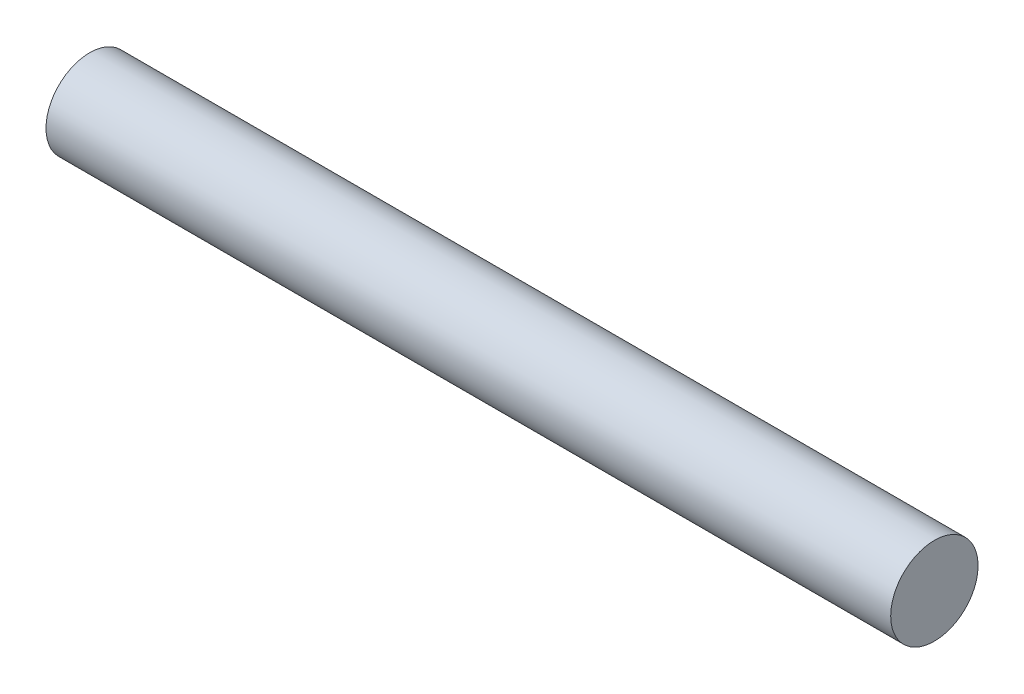
ISO-10303-21;
HEADER;
FILE_DESCRIPTION(('STEP AP214'),'2;1');
FILE_NAME('part.step','',(''),(''),'','','');
FILE_SCHEMA(('AUTOMOTIVE_DESIGN { 1 0 10303 214 1 1 1 1 }'));
ENDSEC;
DATA;
#1=APPLICATION_CONTEXT('core data for automotive mechanical design processes');
#2=APPLICATION_PROTOCOL_DEFINITION('international standard','automotive_design',2000,#1);
#3=PRODUCT_CONTEXT('',#1,'mechanical');
#4=PRODUCT('Part','Part','',(#3));
#5=PRODUCT_RELATED_PRODUCT_CATEGORY('part','',(#4));
#6=PRODUCT_DEFINITION_FORMATION('','',#4);
#7=PRODUCT_DEFINITION_CONTEXT('part definition',#1,'design');
#8=PRODUCT_DEFINITION('design','',#6,#7);
#9=PRODUCT_DEFINITION_SHAPE('','',#8);
#10=(LENGTH_UNIT() NAMED_UNIT(*) SI_UNIT(.MILLI.,.METRE.));
#11=(NAMED_UNIT(*) PLANE_ANGLE_UNIT() SI_UNIT($,.RADIAN.));
#12=(NAMED_UNIT(*) SI_UNIT($,.STERADIAN.) SOLID_ANGLE_UNIT());
#13=UNCERTAINTY_MEASURE_WITH_UNIT(LENGTH_MEASURE(1.E-05),#10,'distance_accuracy_value','');
#14=(GEOMETRIC_REPRESENTATION_CONTEXT(3) GLOBAL_UNCERTAINTY_ASSIGNED_CONTEXT((#13)) GLOBAL_UNIT_ASSIGNED_CONTEXT((#10,
#11,#12)) REPRESENTATION_CONTEXT('',''));
#15=CARTESIAN_POINT('',(0.,0.,0.));
#16=DIRECTION('',(0.,0.,1.));
#17=DIRECTION('',(1.,0.,0.));
#18=AXIS2_PLACEMENT_3D('',#15,#16,#17);
#19=CARTESIAN_POINT('',(29.,0.,0.));
#20=DIRECTION('',(-1.,0.,0.));
#21=DIRECTION('',(0.,0.,1.));
#22=AXIS2_PLACEMENT_3D('',#19,#20,#21);
#23=CYLINDRICAL_SURFACE('',#22,1.5);
#24=CARTESIAN_POINT('',(29.,0.,0.));
#25=DIRECTION('',(1.,0.,0.));
#26=DIRECTION('',(0.,0.,-1.));
#27=AXIS2_PLACEMENT_3D('',#24,#25,#26);
#28=CIRCLE('',#27,1.5);
#29=CARTESIAN_POINT('',(29.,0.,1.5));
#30=VERTEX_POINT('',#29);
#31=EDGE_CURVE('E12',#30,#30,#28,.T.);
#32=CARTESIAN_POINT('',(0.,0.,0.));
#33=DIRECTION('',(1.,0.,0.));
#34=DIRECTION('',(0.,0.,-1.));
#35=AXIS2_PLACEMENT_3D('',#32,#33,#34);
#36=CIRCLE('',#35,1.5);
#37=CARTESIAN_POINT('',(0.,0.,1.5));
#38=VERTEX_POINT('',#37);
#39=EDGE_CURVE('E49',#38,#38,#36,.T.);
#40=CARTESIAN_POINT('',(29.,0.,1.5));
#41=CARTESIAN_POINT('',(28.6979166666667,0.,1.5));
#42=CARTESIAN_POINT('',(28.3958333333333,0.,1.5));
#43=CARTESIAN_POINT('',(27.7916666666667,0.,1.5));
#44=CARTESIAN_POINT('',(27.4895833333333,0.,1.5));
#45=CARTESIAN_POINT('',(26.8854166666667,0.,1.5));
#46=CARTESIAN_POINT('',(26.5833333333333,0.,1.5));
#47=CARTESIAN_POINT('',(25.9791666666667,0.,1.5));
#48=CARTESIAN_POINT('',(25.6770833333333,0.,1.5));
#49=CARTESIAN_POINT('',(25.0729166666667,0.,1.5));
#50=CARTESIAN_POINT('',(24.7708333333333,0.,1.5));
#51=CARTESIAN_POINT('',(24.1666666666667,0.,1.5));
#52=CARTESIAN_POINT('',(23.8645833333333,0.,1.5));
#53=CARTESIAN_POINT('',(23.2604166666667,0.,1.5));
#54=CARTESIAN_POINT('',(22.9583333333333,0.,1.5));
#55=CARTESIAN_POINT('',(22.3541666666667,0.,1.5));
#56=CARTESIAN_POINT('',(22.0520833333333,0.,1.5));
#57=CARTESIAN_POINT('',(21.4479166666667,0.,1.5));
#58=CARTESIAN_POINT('',(21.1458333333333,0.,1.5));
#59=CARTESIAN_POINT('',(20.5416666666667,0.,1.5));
#60=CARTESIAN_POINT('',(20.2395833333333,0.,1.5));
#61=CARTESIAN_POINT('',(19.6354166666667,0.,1.5));
#62=CARTESIAN_POINT('',(19.3333333333333,0.,1.5));
#63=CARTESIAN_POINT('',(18.7291666666667,0.,1.5));
#64=CARTESIAN_POINT('',(18.4270833333333,0.,1.5));
#65=CARTESIAN_POINT('',(17.8229166666667,0.,1.5));
#66=CARTESIAN_POINT('',(17.5208333333333,0.,1.5));
#67=CARTESIAN_POINT('',(16.9166666666667,0.,1.5));
#68=CARTESIAN_POINT('',(16.6145833333333,0.,1.5));
#69=CARTESIAN_POINT('',(16.0104166666667,0.,1.5));
#70=CARTESIAN_POINT('',(15.7083333333333,0.,1.5));
#71=CARTESIAN_POINT('',(15.1041666666667,0.,1.5));
#72=CARTESIAN_POINT('',(14.8020833333333,0.,1.5));
#73=CARTESIAN_POINT('',(14.1979166666667,0.,1.5));
#74=CARTESIAN_POINT('',(13.8958333333333,0.,1.5));
#75=CARTESIAN_POINT('',(13.2916666666667,0.,1.5));
#76=CARTESIAN_POINT('',(12.9895833333333,0.,1.5));
#77=CARTESIAN_POINT('',(12.3854166666667,0.,1.5));
#78=CARTESIAN_POINT('',(12.0833333333333,0.,1.5));
#79=CARTESIAN_POINT('',(11.4791666666667,0.,1.5));
#80=CARTESIAN_POINT('',(11.1770833333333,0.,1.5));
#81=CARTESIAN_POINT('',(10.5729166666667,0.,1.5));
#82=CARTESIAN_POINT('',(10.2708333333333,0.,1.5));
#83=CARTESIAN_POINT('',(9.66666666666667,0.,1.5));
#84=CARTESIAN_POINT('',(9.36458333333334,0.,1.5));
#85=CARTESIAN_POINT('',(8.76041666666667,0.,1.5));
#86=CARTESIAN_POINT('',(8.45833333333334,0.,1.5));
#87=CARTESIAN_POINT('',(7.85416666666667,0.,1.5));
#88=CARTESIAN_POINT('',(7.55208333333334,0.,1.5));
#89=CARTESIAN_POINT('',(6.94791666666667,0.,1.5));
#90=CARTESIAN_POINT('',(6.64583333333334,0.,1.5));
#91=CARTESIAN_POINT('',(6.04166666666667,0.,1.5));
#92=CARTESIAN_POINT('',(5.73958333333334,0.,1.5));
#93=CARTESIAN_POINT('',(5.13541666666667,0.,1.5));
#94=CARTESIAN_POINT('',(4.83333333333334,0.,1.5));
#95=CARTESIAN_POINT('',(4.22916666666667,0.,1.5));
#96=CARTESIAN_POINT('',(3.92708333333334,0.,1.5));
#97=CARTESIAN_POINT('',(3.32291666666667,0.,1.5));
#98=CARTESIAN_POINT('',(3.02083333333334,0.,1.5));
#99=CARTESIAN_POINT('',(2.41666666666667,0.,1.5));
#100=CARTESIAN_POINT('',(2.11458333333334,0.,1.5));
#101=CARTESIAN_POINT('',(1.51041666666667,0.,1.5));
#102=CARTESIAN_POINT('',(1.20833333333334,0.,1.5));
#103=CARTESIAN_POINT('',(0.60416666666667,0.,1.5));
#104=CARTESIAN_POINT('',(0.302083333333336,0.,1.5));
#105=CARTESIAN_POINT('',(0.,0.,1.5));
#106=B_SPLINE_CURVE_WITH_KNOTS('',3,(#40,#41,#42,#43,#44,#45,#46,#47,#48,#49,#50,#51,#52,#53,
#54,#55,#56,#57,#58,#59,#60,#61,#62,#63,#64,#65,#66,#67,#68,#69,#70,#71,#72,#73,#74,#75,#76,#77,
#78,#79,#80,#81,#82,#83,#84,#85,#86,#87,#88,#89,#90,#91,#92,#93,#94,#95,#96,#97,#98,#99,#100,
#101,#102,#103,#104,#105),.UNSPECIFIED.,.F.,.F.,(4,2,2,2,2,2,2,2,2,2,2,2,2,2,2,2,2,2,2,2,2,2,2,
2,2,2,2,2,2,2,2,2,4),(0.,0.906249999999997,1.8125,2.71875,3.625,4.53125,5.4375,6.34375,7.25,
8.15625,9.0625,9.96875,10.875,11.78125,12.6875,13.59375,14.5,15.40625,16.3125,17.21875,18.125,
19.03125,19.9375,20.84375,21.75,22.65625,23.5625,24.46875,25.375,26.28125,27.1875,28.09375,29.),.UNSPECIFIED.);
#107=EDGE_CURVE('BSEAM46',#30,#38,#106,.T.);
#108=ORIENTED_EDGE('',*,*,#31,.F.);
#109=ORIENTED_EDGE('',*,*,#39,.T.);
#110=ORIENTED_EDGE('',*,*,#107,.T.);
#111=ORIENTED_EDGE('',*,*,#107,.F.);
#112=EDGE_LOOP('',(#108,#110,#109,#111));
#113=FACE_BOUND('',#112,.T.);
#114=ADVANCED_FACE('F46',(#113),#23,.T.);
#115=CARTESIAN_POINT('',(29.,0.,0.));
#116=DIRECTION('',(1.,0.,0.));
#117=DIRECTION('',(0.,0.,-1.));
#118=AXIS2_PLACEMENT_3D('',#115,#116,#117);
#119=PLANE('',#118);
#120=ORIENTED_EDGE('',*,*,#31,.T.);
#121=EDGE_LOOP('',(#120));
#122=FACE_BOUND('',#121,.T.);
#123=ADVANCED_FACE('F61',(#122),#119,.T.);
#124=CARTESIAN_POINT('',(0.,0.,0.));
#125=DIRECTION('',(1.,0.,0.));
#126=DIRECTION('',(0.,0.,-1.));
#127=AXIS2_PLACEMENT_3D('',#124,#125,#126);
#128=PLANE('',#127);
#129=ORIENTED_EDGE('',*,*,#39,.F.);
#130=EDGE_LOOP('',(#129));
#131=FACE_BOUND('',#130,.T.);
#132=ADVANCED_FACE('F59',(#131),#128,.F.);
#133=CLOSED_SHELL('',(#114,#123,#132));
#134=MANIFOLD_SOLID_BREP('B2',#133);
#135=ADVANCED_BREP_SHAPE_REPRESENTATION('',(#18,#134),#14);
#136=SHAPE_DEFINITION_REPRESENTATION(#9,#135);
ENDSEC;
END-ISO-10303-21;
